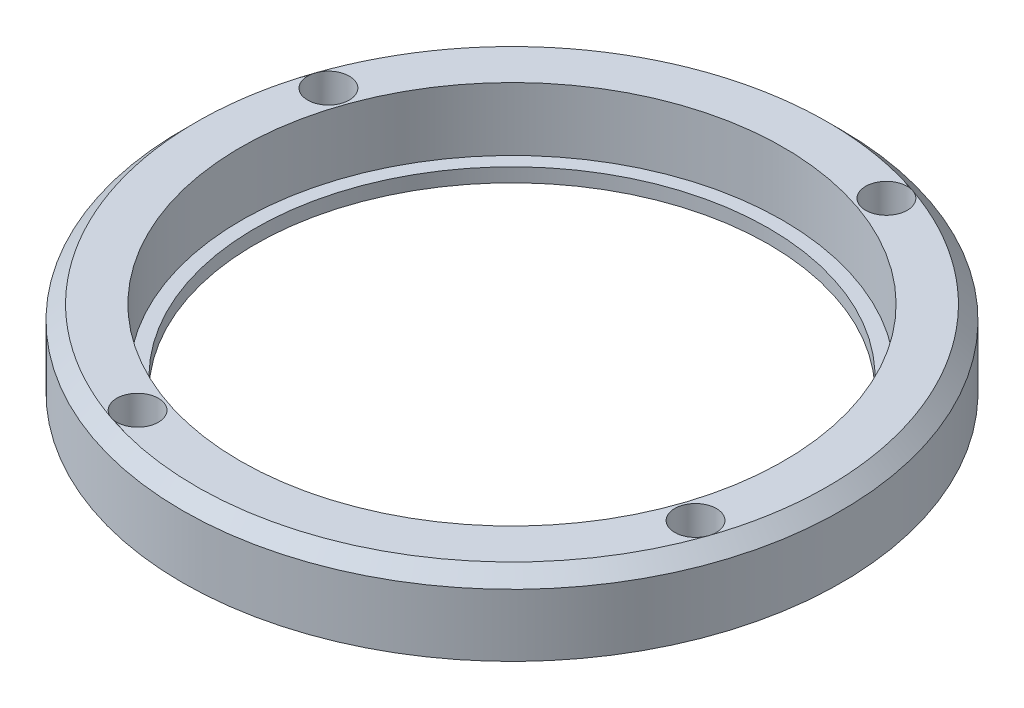
ISO-10303-21;
HEADER;
FILE_DESCRIPTION(('STEP AP214'),'2;1');
FILE_NAME('part.step','',(''),(''),'','','');
FILE_SCHEMA(('AUTOMOTIVE_DESIGN { 1 0 10303 214 1 1 1 1 }'));
ENDSEC;
DATA;
#1=APPLICATION_CONTEXT('core data for automotive mechanical design processes');
#2=APPLICATION_PROTOCOL_DEFINITION('international standard','automotive_design',2000,#1);
#3=PRODUCT_CONTEXT('',#1,'mechanical');
#4=PRODUCT('Part','Part','',(#3));
#5=PRODUCT_RELATED_PRODUCT_CATEGORY('part','',(#4));
#6=PRODUCT_DEFINITION_FORMATION('','',#4);
#7=PRODUCT_DEFINITION_CONTEXT('part definition',#1,'design');
#8=PRODUCT_DEFINITION('design','',#6,#7);
#9=PRODUCT_DEFINITION_SHAPE('','',#8);
#10=(LENGTH_UNIT() NAMED_UNIT(*) SI_UNIT(.MILLI.,.METRE.));
#11=(NAMED_UNIT(*) PLANE_ANGLE_UNIT() SI_UNIT($,.RADIAN.));
#12=(NAMED_UNIT(*) SI_UNIT($,.STERADIAN.) SOLID_ANGLE_UNIT());
#13=UNCERTAINTY_MEASURE_WITH_UNIT(LENGTH_MEASURE(1.E-05),#10,'distance_accuracy_value','');
#14=(GEOMETRIC_REPRESENTATION_CONTEXT(3) GLOBAL_UNCERTAINTY_ASSIGNED_CONTEXT((#13)) GLOBAL_UNIT_ASSIGNED_CONTEXT((#10,
#11,#12)) REPRESENTATION_CONTEXT('',''));
#15=CARTESIAN_POINT('',(0.,0.,0.));
#16=DIRECTION('',(0.,0.,1.));
#17=DIRECTION('',(1.,0.,0.));
#18=AXIS2_PLACEMENT_3D('',#15,#16,#17);
#19=CARTESIAN_POINT('',(0.,2.,0.));
#20=DIRECTION('',(0.,-1.,0.));
#21=DIRECTION('',(0.,0.,-1.));
#22=AXIS2_PLACEMENT_3D('',#19,#20,#21);
#23=CYLINDRICAL_SURFACE('',#22,39.);
#24=CARTESIAN_POINT('',(0.,2.,0.));
#25=DIRECTION('',(0.,-1.,0.));
#26=DIRECTION('',(0.,0.,-1.));
#27=AXIS2_PLACEMENT_3D('',#24,#25,#26);
#28=CIRCLE('',#27,39.);
#29=CARTESIAN_POINT('',(0.,2.,-39.));
#30=VERTEX_POINT('',#29);
#31=EDGE_CURVE('E11',#30,#30,#28,.T.);
#32=ORIENTED_EDGE('',*,*,#31,.T.);
#33=EDGE_LOOP('',(#32));
#34=FACE_BOUND('',#33,.T.);
#35=CARTESIAN_POINT('',(0.,0.,0.));
#36=DIRECTION('',(0.,-1.,0.));
#37=DIRECTION('',(0.,0.,-1.));
#38=AXIS2_PLACEMENT_3D('',#35,#36,#37);
#39=CIRCLE('',#38,39.);
#40=CARTESIAN_POINT('',(0.,0.,-39.));
#41=VERTEX_POINT('',#40);
#42=EDGE_CURVE('E44',#41,#41,#39,.T.);
#43=ORIENTED_EDGE('',*,*,#42,.F.);
#44=EDGE_LOOP('',(#43));
#45=FACE_BOUND('',#44,.T.);
#46=ADVANCED_FACE('F41',(#34,#45),#23,.T.);
#47=CARTESIAN_POINT('',(0.,2.,0.));
#48=DIRECTION('',(0.,-1.,0.));
#49=DIRECTION('',(0.,0.,-1.));
#50=AXIS2_PLACEMENT_3D('',#47,#48,#49);
#51=PLANE('',#50);
#52=CARTESIAN_POINT('',(0.,2.,0.));
#53=DIRECTION('',(0.,-1.,0.));
#54=DIRECTION('',(0.,0.,-1.));
#55=AXIS2_PLACEMENT_3D('',#52,#53,#54);
#56=CIRCLE('',#55,37.);
#57=CARTESIAN_POINT('',(0.,2.,-37.));
#58=VERTEX_POINT('',#57);
#59=EDGE_CURVE('E51',#58,#58,#56,.T.);
#60=ORIENTED_EDGE('',*,*,#59,.T.);
#61=EDGE_LOOP('',(#60));
#62=FACE_BOUND('',#61,.T.);
#63=ORIENTED_EDGE('',*,*,#31,.F.);
#64=EDGE_LOOP('',(#63));
#65=FACE_BOUND('',#64,.T.);
#66=ADVANCED_FACE('F59',(#62,#65),#51,.F.);
#67=CARTESIAN_POINT('',(0.,0.,0.));
#68=DIRECTION('',(0.,-1.,0.));
#69=DIRECTION('',(0.,0.,-1.));
#70=AXIS2_PLACEMENT_3D('',#67,#68,#69);
#71=PLANE('',#70);
#72=CARTESIAN_POINT('',(0.,0.,0.));
#73=DIRECTION('',(0.,-1.,0.));
#74=DIRECTION('',(0.,0.,-1.));
#75=AXIS2_PLACEMENT_3D('',#72,#73,#74);
#76=CIRCLE('',#75,37.);
#77=CARTESIAN_POINT('',(0.,0.,-37.));
#78=VERTEX_POINT('',#77);
#79=EDGE_CURVE('E53',#78,#78,#76,.T.);
#80=ORIENTED_EDGE('',*,*,#79,.F.);
#81=EDGE_LOOP('',(#80));
#82=FACE_BOUND('',#81,.T.);
#83=ORIENTED_EDGE('',*,*,#42,.T.);
#84=EDGE_LOOP('',(#83));
#85=FACE_BOUND('',#84,.T.);
#86=ADVANCED_FACE('F65',(#82,#85),#71,.T.);
#87=CARTESIAN_POINT('',(0.,2.,0.));
#88=DIRECTION('',(0.,-1.,0.));
#89=DIRECTION('',(0.,0.,-1.));
#90=AXIS2_PLACEMENT_3D('',#87,#88,#89);
#91=CYLINDRICAL_SURFACE('',#90,37.);
#92=ORIENTED_EDGE('',*,*,#59,.F.);
#93=EDGE_LOOP('',(#92));
#94=FACE_BOUND('',#93,.T.);
#95=ORIENTED_EDGE('',*,*,#79,.T.);
#96=EDGE_LOOP('',(#95));
#97=FACE_BOUND('',#96,.T.);
#98=ADVANCED_FACE('F62',(#94,#97),#91,.F.);
#99=CLOSED_SHELL('',(#46,#66,#86,#98));
#100=MANIFOLD_SOLID_BREP('B2',#99);
#101=CARTESIAN_POINT('',(-40.2120742919079,0.,-13.7564196338321));
#102=DIRECTION('',(0.,1.,0.));
#103=DIRECTION('',(0.,0.,1.));
#104=AXIS2_PLACEMENT_3D('',#101,#102,#103);
#105=CYLINDRICAL_SURFACE('',#104,1.75);
#106=CARTESIAN_POINT('',(-40.2120742919079,0.,-13.7564196338321));
#107=DIRECTION('',(0.,1.,0.));
#108=DIRECTION('',(0.,0.,1.));
#109=AXIS2_PLACEMENT_3D('',#106,#107,#108);
#110=CIRCLE('',#109,1.75);
#111=CARTESIAN_POINT('',(-40.2120742919079,0.,-12.0064196338321));
#112=VERTEX_POINT('',#111);
#113=EDGE_CURVE('E157',#112,#112,#110,.T.);
#114=ORIENTED_EDGE('',*,*,#113,.F.);
#115=EDGE_LOOP('',(#114));
#116=FACE_BOUND('',#115,.T.);
#117=CARTESIAN_POINT('',(-40.2120742919079,5.,-13.7564196338321));
#118=DIRECTION('',(0.,1.,0.));
#119=DIRECTION('',(0.,0.,1.));
#120=AXIS2_PLACEMENT_3D('',#117,#118,#119);
#121=CIRCLE('',#120,1.75);
#122=CARTESIAN_POINT('',(-40.2120742919079,5.,-12.0064196338321));
#123=VERTEX_POINT('',#122);
#124=EDGE_CURVE('E107',#123,#123,#121,.F.);
#125=ORIENTED_EDGE('',*,*,#124,.F.);
#126=EDGE_LOOP('',(#125));
#127=FACE_BOUND('',#126,.T.);
#128=ADVANCED_FACE('F103',(#116,#127),#105,.F.);
#129=CARTESIAN_POINT('',(-13.7564196338321,0.,40.2120742919079));
#130=DIRECTION('',(0.,1.,0.));
#131=DIRECTION('',(0.,0.,1.));
#132=AXIS2_PLACEMENT_3D('',#129,#130,#131);
#133=CYLINDRICAL_SURFACE('',#132,1.75);
#134=CARTESIAN_POINT('',(-13.7564196338321,0.,40.2120742919079));
#135=DIRECTION('',(0.,1.,0.));
#136=DIRECTION('',(0.,0.,1.));
#137=AXIS2_PLACEMENT_3D('',#134,#135,#136);
#138=CIRCLE('',#137,1.75);
#139=CARTESIAN_POINT('',(-13.7564196338321,0.,41.9620742919079));
#140=VERTEX_POINT('',#139);
#141=EDGE_CURVE('E154',#140,#140,#138,.T.);
#142=ORIENTED_EDGE('',*,*,#141,.F.);
#143=EDGE_LOOP('',(#142));
#144=FACE_BOUND('',#143,.T.);
#145=CARTESIAN_POINT('',(-13.7564196338321,5.,40.2120742919079));
#146=DIRECTION('',(0.,1.,0.));
#147=DIRECTION('',(0.,0.,1.));
#148=AXIS2_PLACEMENT_3D('',#145,#146,#147);
#149=CIRCLE('',#148,1.75);
#150=CARTESIAN_POINT('',(-13.7564196338321,5.,41.9620742919079));
#151=VERTEX_POINT('',#150);
#152=EDGE_CURVE('E177',#151,#151,#149,.F.);
#153=ORIENTED_EDGE('',*,*,#152,.F.);
#154=EDGE_LOOP('',(#153));
#155=FACE_BOUND('',#154,.T.);
#156=ADVANCED_FACE('F187',(#144,#155),#133,.F.);
#157=CARTESIAN_POINT('',(40.2120742919079,0.,13.7564196338322));
#158=DIRECTION('',(0.,1.,0.));
#159=DIRECTION('',(0.,0.,1.));
#160=AXIS2_PLACEMENT_3D('',#157,#158,#159);
#161=CYLINDRICAL_SURFACE('',#160,1.75);
#162=CARTESIAN_POINT('',(40.2120742919079,0.,13.7564196338322));
#163=DIRECTION('',(0.,1.,0.));
#164=DIRECTION('',(0.,0.,1.));
#165=AXIS2_PLACEMENT_3D('',#162,#163,#164);
#166=CIRCLE('',#165,1.75);
#167=CARTESIAN_POINT('',(40.2120742919079,0.,15.5064196338322));
#168=VERTEX_POINT('',#167);
#169=EDGE_CURVE('E151',#168,#168,#166,.T.);
#170=ORIENTED_EDGE('',*,*,#169,.F.);
#171=EDGE_LOOP('',(#170));
#172=FACE_BOUND('',#171,.T.);
#173=CARTESIAN_POINT('',(40.2120742919079,5.,13.7564196338322));
#174=DIRECTION('',(0.,1.,0.));
#175=DIRECTION('',(0.,0.,1.));
#176=AXIS2_PLACEMENT_3D('',#173,#174,#175);
#177=CIRCLE('',#176,1.75);
#178=CARTESIAN_POINT('',(40.2120742919079,5.,15.5064196338322));
#179=VERTEX_POINT('',#178);
#180=EDGE_CURVE('E174',#179,#179,#177,.F.);
#181=ORIENTED_EDGE('',*,*,#180,.F.);
#182=EDGE_LOOP('',(#181));
#183=FACE_BOUND('',#182,.T.);
#184=ADVANCED_FACE('F193',(#172,#183),#161,.F.);
#185=CARTESIAN_POINT('',(13.7564196338321,0.,-40.2120742919078));
#186=DIRECTION('',(0.,1.,0.));
#187=DIRECTION('',(0.,0.,1.));
#188=AXIS2_PLACEMENT_3D('',#185,#186,#187);
#189=CYLINDRICAL_SURFACE('',#188,1.75000000000001);
#190=CARTESIAN_POINT('',(13.7564196338321,0.,-40.2120742919078));
#191=DIRECTION('',(0.,1.,0.));
#192=DIRECTION('',(0.,0.,1.));
#193=AXIS2_PLACEMENT_3D('',#190,#191,#192);
#194=CIRCLE('',#193,1.75000000000001);
#195=CARTESIAN_POINT('',(13.7564196338321,0.,-38.4620742919078));
#196=VERTEX_POINT('',#195);
#197=EDGE_CURVE('E147',#196,#196,#194,.T.);
#198=ORIENTED_EDGE('',*,*,#197,.F.);
#199=EDGE_LOOP('',(#198));
#200=FACE_BOUND('',#199,.T.);
#201=CARTESIAN_POINT('',(13.7564196338321,5.,-40.2120742919078));
#202=DIRECTION('',(0.,1.,0.));
#203=DIRECTION('',(0.,0.,1.));
#204=AXIS2_PLACEMENT_3D('',#201,#202,#203);
#205=CIRCLE('',#204,1.75000000000001);
#206=CARTESIAN_POINT('',(13.7564196338321,5.,-38.4620742919078));
#207=VERTEX_POINT('',#206);
#208=EDGE_CURVE('E171',#207,#207,#205,.F.);
#209=ORIENTED_EDGE('',*,*,#208,.F.);
#210=EDGE_LOOP('',(#209));
#211=FACE_BOUND('',#210,.T.);
#212=ADVANCED_FACE('F211',(#200,#211),#189,.F.);
#213=CARTESIAN_POINT('',(0.,11.,0.));
#214=DIRECTION('',(0.,-1.,0.));
#215=DIRECTION('',(0.,0.,-1.));
#216=AXIS2_PLACEMENT_3D('',#213,#214,#215);
#217=CYLINDRICAL_SURFACE('',#216,47.5);
#218=CARTESIAN_POINT('',(0.,9.00000000000001,0.));
#219=DIRECTION('',(0.,1.,0.));
#220=DIRECTION('',(0.,0.,1.));
#221=AXIS2_PLACEMENT_3D('',#218,#219,#220);
#222=CIRCLE('',#221,47.5);
#223=CARTESIAN_POINT('',(0.,9.00000000000001,47.5));
#224=VERTEX_POINT('',#223);
#225=EDGE_CURVE('E39',#224,#224,#222,.F.);
#226=ORIENTED_EDGE('',*,*,#225,.T.);
#227=EDGE_LOOP('',(#226));
#228=FACE_BOUND('',#227,.T.);
#229=CARTESIAN_POINT('',(0.,0.,0.));
#230=DIRECTION('',(0.,1.,0.));
#231=DIRECTION('',(0.,0.,1.));
#232=AXIS2_PLACEMENT_3D('',#229,#230,#231);
#233=CIRCLE('',#232,47.5);
#234=CARTESIAN_POINT('',(0.,0.,47.5));
#235=VERTEX_POINT('',#234);
#236=EDGE_CURVE('E163',#235,#235,#233,.T.);
#237=ORIENTED_EDGE('',*,*,#236,.T.);
#238=EDGE_LOOP('',(#237));
#239=FACE_BOUND('',#238,.T.);
#240=ADVANCED_FACE('F207',(#228,#239),#217,.T.);
#241=CARTESIAN_POINT('',(0.,11.,0.));
#242=DIRECTION('',(0.,1.,0.));
#243=DIRECTION('',(0.,0.,1.));
#244=AXIS2_PLACEMENT_3D('',#241,#242,#243);
#245=PLANE('',#244);
#246=CARTESIAN_POINT('',(0.,11.,0.));
#247=DIRECTION('',(0.,1.,0.));
#248=DIRECTION('',(0.,0.,1.));
#249=AXIS2_PLACEMENT_3D('',#246,#247,#248);
#250=CIRCLE('',#249,45.5);
#251=CARTESIAN_POINT('',(-43.0505736536896,11.,-14.7274610197496));
#252=VERTEX_POINT('',#251);
#253=CARTESIAN_POINT('',(-14.7274610197497,11.,43.0505736536896));
#254=VERTEX_POINT('',#253);
#255=EDGE_CURVE('E390',#252,#254,#250,.T.);
#256=ORIENTED_EDGE('',*,*,#255,.T.);
#257=CARTESIAN_POINT('',(-13.7564196338321,11.,40.2120742919079));
#258=DIRECTION('',(0.,1.,0.));
#259=DIRECTION('',(0.,0.,1.));
#260=AXIS2_PLACEMENT_3D('',#257,#258,#259);
#261=CIRCLE('',#260,3.);
#262=EDGE_CURVE('E118',#254,#254,#261,.T.);
#263=ORIENTED_EDGE('',*,*,#262,.F.);
#264=CARTESIAN_POINT('',(43.0505736536896,11.,14.7274610197497));
#265=VERTEX_POINT('',#264);
#266=EDGE_CURVE('E168',#254,#265,#250,.T.);
#267=ORIENTED_EDGE('',*,*,#266,.T.);
#268=CARTESIAN_POINT('',(40.2120742919079,11.,13.7564196338322));
#269=DIRECTION('',(0.,1.,0.));
#270=DIRECTION('',(0.,0.,1.));
#271=AXIS2_PLACEMENT_3D('',#268,#269,#270);
#272=CIRCLE('',#271,3.);
#273=EDGE_CURVE('E131',#265,#265,#272,.T.);
#274=ORIENTED_EDGE('',*,*,#273,.F.);
#275=CARTESIAN_POINT('',(14.7274610197497,11.,-43.0505736536896));
#276=VERTEX_POINT('',#275);
#277=EDGE_CURVE('E112',#265,#276,#250,.T.);
#278=ORIENTED_EDGE('',*,*,#277,.T.);
#279=CARTESIAN_POINT('',(13.7564196338321,11.,-40.2120742919078));
#280=DIRECTION('',(0.,1.,0.));
#281=DIRECTION('',(0.,0.,1.));
#282=AXIS2_PLACEMENT_3D('',#279,#280,#281);
#283=CIRCLE('',#282,2.99999999999999);
#284=EDGE_CURVE('E140',#276,#276,#283,.T.);
#285=ORIENTED_EDGE('',*,*,#284,.F.);
#286=EDGE_CURVE('E169',#276,#252,#250,.T.);
#287=ORIENTED_EDGE('',*,*,#286,.T.);
#288=CARTESIAN_POINT('',(-40.2120742919079,11.,-13.7564196338321));
#289=DIRECTION('',(0.,1.,0.));
#290=DIRECTION('',(0.,0.,1.));
#291=AXIS2_PLACEMENT_3D('',#288,#289,#290);
#292=CIRCLE('',#291,3.);
#293=EDGE_CURVE('E123',#252,#252,#292,.T.);
#294=ORIENTED_EDGE('',*,*,#293,.F.);
#295=EDGE_LOOP('',(#256,#263,#267,#274,#278,#285,#287,#294));
#296=FACE_BOUND('',#295,.T.);
#297=CARTESIAN_POINT('',(0.,11.,0.));
#298=DIRECTION('',(0.,1.,0.));
#299=DIRECTION('',(0.,0.,1.));
#300=AXIS2_PLACEMENT_3D('',#297,#298,#299);
#301=CIRCLE('',#300,39.15);
#302=CARTESIAN_POINT('',(0.,11.,39.15));
#303=VERTEX_POINT('',#302);
#304=EDGE_CURVE('E150',#303,#303,#301,.T.);
#305=ORIENTED_EDGE('',*,*,#304,.F.);
#306=EDGE_LOOP('',(#305));
#307=FACE_BOUND('',#306,.T.);
#308=ADVANCED_FACE('F204',(#296,#307),#245,.T.);
#309=CARTESIAN_POINT('',(0.,0.,0.));
#310=DIRECTION('',(0.,1.,0.));
#311=DIRECTION('',(0.,0.,1.));
#312=AXIS2_PLACEMENT_3D('',#309,#310,#311);
#313=PLANE('',#312);
#314=ORIENTED_EDGE('',*,*,#197,.T.);
#315=EDGE_LOOP('',(#314));
#316=FACE_BOUND('',#315,.T.);
#317=ORIENTED_EDGE('',*,*,#169,.T.);
#318=EDGE_LOOP('',(#317));
#319=FACE_BOUND('',#318,.T.);
#320=ORIENTED_EDGE('',*,*,#141,.T.);
#321=EDGE_LOOP('',(#320));
#322=FACE_BOUND('',#321,.T.);
#323=ORIENTED_EDGE('',*,*,#113,.T.);
#324=EDGE_LOOP('',(#323));
#325=FACE_BOUND('',#324,.T.);
#326=CARTESIAN_POINT('',(0.,0.,0.));
#327=DIRECTION('',(0.,1.,0.));
#328=DIRECTION('',(0.,0.,1.));
#329=AXIS2_PLACEMENT_3D('',#326,#327,#328);
#330=CIRCLE('',#329,39.15);
#331=CARTESIAN_POINT('',(0.,0.,39.15));
#332=VERTEX_POINT('',#331);
#333=EDGE_CURVE('E160',#332,#332,#330,.T.);
#334=ORIENTED_EDGE('',*,*,#333,.T.);
#335=EDGE_LOOP('',(#334));
#336=FACE_BOUND('',#335,.T.);
#337=ORIENTED_EDGE('',*,*,#236,.F.);
#338=EDGE_LOOP('',(#337));
#339=FACE_BOUND('',#338,.T.);
#340=ADVANCED_FACE('F202',(#316,#319,#322,#325,#336,#339),#313,.F.);
#341=CARTESIAN_POINT('',(0.,0.,0.));
#342=DIRECTION('',(0.,1.,0.));
#343=DIRECTION('',(0.,0.,1.));
#344=AXIS2_PLACEMENT_3D('',#341,#342,#343);
#345=CYLINDRICAL_SURFACE('',#344,39.15);
#346=ORIENTED_EDGE('',*,*,#333,.F.);
#347=EDGE_LOOP('',(#346));
#348=FACE_BOUND('',#347,.T.);
#349=ORIENTED_EDGE('',*,*,#304,.T.);
#350=EDGE_LOOP('',(#349));
#351=FACE_BOUND('',#350,.T.);
#352=ADVANCED_FACE('F199',(#348,#351),#345,.F.);
#353=CARTESIAN_POINT('',(0.,11.,0.));
#354=DIRECTION('',(0.,-1.,0.));
#355=DIRECTION('',(0.,0.,-1.));
#356=AXIS2_PLACEMENT_3D('',#353,#354,#355);
#357=CONICAL_SURFACE('',#356,45.5,0.785398163397448);
#358=ORIENTED_EDGE('',*,*,#225,.F.);
#359=EDGE_LOOP('',(#358));
#360=FACE_BOUND('',#359,.T.);
#361=ORIENTED_EDGE('',*,*,#277,.F.);
#362=ORIENTED_EDGE('',*,*,#266,.F.);
#363=ORIENTED_EDGE('',*,*,#255,.F.);
#364=ORIENTED_EDGE('',*,*,#286,.F.);
#365=EDGE_LOOP('',(#361,#362,#363,#364));
#366=FACE_BOUND('',#365,.T.);
#367=ADVANCED_FACE('F105',(#360,#366),#357,.T.);
#368=CARTESIAN_POINT('',(13.7564196338321,5.,-40.2120742919078));
#369=DIRECTION('',(0.,1.,0.));
#370=DIRECTION('',(0.,0.,1.));
#371=AXIS2_PLACEMENT_3D('',#368,#369,#370);
#372=PLANE('',#371);
#373=CARTESIAN_POINT('',(13.7564196338321,5.,-40.2120742919078));
#374=DIRECTION('',(0.,1.,0.));
#375=DIRECTION('',(0.,0.,1.));
#376=AXIS2_PLACEMENT_3D('',#373,#374,#375);
#377=CIRCLE('',#376,2.99999999999999);
#378=CARTESIAN_POINT('',(13.7564196338321,5.,-37.2120742919078));
#379=VERTEX_POINT('',#378);
#380=EDGE_CURVE('E235',#379,#379,#377,.T.);
#381=ORIENTED_EDGE('',*,*,#380,.T.);
#382=EDGE_LOOP('',(#381));
#383=FACE_BOUND('',#382,.T.);
#384=ORIENTED_EDGE('',*,*,#208,.T.);
#385=EDGE_LOOP('',(#384));
#386=FACE_BOUND('',#385,.T.);
#387=ADVANCED_FACE('F225',(#383,#386),#372,.T.);
#388=CARTESIAN_POINT('',(13.7564196338321,5.,-40.2120742919078));
#389=DIRECTION('',(0.,1.,0.));
#390=DIRECTION('',(0.,0.,1.));
#391=AXIS2_PLACEMENT_3D('',#388,#389,#390);
#392=CYLINDRICAL_SURFACE('',#391,2.99999999999999);
#393=ORIENTED_EDGE('',*,*,#380,.F.);
#394=EDGE_LOOP('',(#393));
#395=FACE_BOUND('',#394,.T.);
#396=ORIENTED_EDGE('',*,*,#284,.T.);
#397=EDGE_LOOP('',(#396));
#398=FACE_BOUND('',#397,.T.);
#399=ADVANCED_FACE('F259',(#395,#398),#392,.F.);
#400=CARTESIAN_POINT('',(40.2120742919079,5.,13.7564196338322));
#401=DIRECTION('',(0.,1.,0.));
#402=DIRECTION('',(0.,0.,1.));
#403=AXIS2_PLACEMENT_3D('',#400,#401,#402);
#404=PLANE('',#403);
#405=CARTESIAN_POINT('',(40.2120742919079,5.,13.7564196338322));
#406=DIRECTION('',(0.,1.,0.));
#407=DIRECTION('',(0.,0.,1.));
#408=AXIS2_PLACEMENT_3D('',#405,#406,#407);
#409=CIRCLE('',#408,3.);
#410=CARTESIAN_POINT('',(40.2120742919079,5.,16.7564196338322));
#411=VERTEX_POINT('',#410);
#412=EDGE_CURVE('E136',#411,#411,#409,.T.);
#413=ORIENTED_EDGE('',*,*,#412,.T.);
#414=EDGE_LOOP('',(#413));
#415=FACE_BOUND('',#414,.T.);
#416=ORIENTED_EDGE('',*,*,#180,.T.);
#417=EDGE_LOOP('',(#416));
#418=FACE_BOUND('',#417,.T.);
#419=ADVANCED_FACE('F263',(#415,#418),#404,.T.);
#420=CARTESIAN_POINT('',(40.2120742919079,5.,13.7564196338322));
#421=DIRECTION('',(0.,1.,0.));
#422=DIRECTION('',(0.,0.,1.));
#423=AXIS2_PLACEMENT_3D('',#420,#421,#422);
#424=CYLINDRICAL_SURFACE('',#423,3.);
#425=ORIENTED_EDGE('',*,*,#412,.F.);
#426=EDGE_LOOP('',(#425));
#427=FACE_BOUND('',#426,.T.);
#428=ORIENTED_EDGE('',*,*,#273,.T.);
#429=EDGE_LOOP('',(#428));
#430=FACE_BOUND('',#429,.T.);
#431=ADVANCED_FACE('F132',(#427,#430),#424,.F.);
#432=CARTESIAN_POINT('',(-13.7564196338321,5.,40.2120742919079));
#433=DIRECTION('',(0.,1.,0.));
#434=DIRECTION('',(0.,0.,1.));
#435=AXIS2_PLACEMENT_3D('',#432,#433,#434);
#436=PLANE('',#435);
#437=CARTESIAN_POINT('',(-13.7564196338321,5.,40.2120742919079));
#438=DIRECTION('',(0.,1.,0.));
#439=DIRECTION('',(0.,0.,1.));
#440=AXIS2_PLACEMENT_3D('',#437,#438,#439);
#441=CIRCLE('',#440,3.);
#442=CARTESIAN_POINT('',(-13.7564196338321,5.,43.2120742919079));
#443=VERTEX_POINT('',#442);
#444=EDGE_CURVE('E175',#443,#443,#441,.T.);
#445=ORIENTED_EDGE('',*,*,#444,.T.);
#446=EDGE_LOOP('',(#445));
#447=FACE_BOUND('',#446,.T.);
#448=ORIENTED_EDGE('',*,*,#152,.T.);
#449=EDGE_LOOP('',(#448));
#450=FACE_BOUND('',#449,.T.);
#451=ADVANCED_FACE('F243',(#447,#450),#436,.T.);
#452=CARTESIAN_POINT('',(-13.7564196338321,5.,40.2120742919079));
#453=DIRECTION('',(0.,1.,0.));
#454=DIRECTION('',(0.,0.,1.));
#455=AXIS2_PLACEMENT_3D('',#452,#453,#454);
#456=CYLINDRICAL_SURFACE('',#455,3.);
#457=ORIENTED_EDGE('',*,*,#444,.F.);
#458=EDGE_LOOP('',(#457));
#459=FACE_BOUND('',#458,.T.);
#460=ORIENTED_EDGE('',*,*,#262,.T.);
#461=EDGE_LOOP('',(#460));
#462=FACE_BOUND('',#461,.T.);
#463=ADVANCED_FACE('F245',(#459,#462),#456,.F.);
#464=CARTESIAN_POINT('',(-40.2120742919079,5.,-13.7564196338321));
#465=DIRECTION('',(0.,1.,0.));
#466=DIRECTION('',(0.,0.,1.));
#467=AXIS2_PLACEMENT_3D('',#464,#465,#466);
#468=PLANE('',#467);
#469=CARTESIAN_POINT('',(-40.2120742919079,5.,-13.7564196338321));
#470=DIRECTION('',(0.,1.,0.));
#471=DIRECTION('',(0.,0.,1.));
#472=AXIS2_PLACEMENT_3D('',#469,#470,#471);
#473=CIRCLE('',#472,3.);
#474=CARTESIAN_POINT('',(-40.2120742919079,5.,-10.7564196338321));
#475=VERTEX_POINT('',#474);
#476=EDGE_CURVE('E137',#475,#475,#473,.T.);
#477=ORIENTED_EDGE('',*,*,#476,.T.);
#478=EDGE_LOOP('',(#477));
#479=FACE_BOUND('',#478,.T.);
#480=ORIENTED_EDGE('',*,*,#124,.T.);
#481=EDGE_LOOP('',(#480));
#482=FACE_BOUND('',#481,.T.);
#483=ADVANCED_FACE('F184',(#479,#482),#468,.T.);
#484=CARTESIAN_POINT('',(-40.2120742919079,5.,-13.7564196338321));
#485=DIRECTION('',(0.,1.,0.));
#486=DIRECTION('',(0.,0.,1.));
#487=AXIS2_PLACEMENT_3D('',#484,#485,#486);
#488=CYLINDRICAL_SURFACE('',#487,3.);
#489=ORIENTED_EDGE('',*,*,#476,.F.);
#490=EDGE_LOOP('',(#489));
#491=FACE_BOUND('',#490,.T.);
#492=ORIENTED_EDGE('',*,*,#293,.T.);
#493=EDGE_LOOP('',(#492));
#494=FACE_BOUND('',#493,.T.);
#495=ADVANCED_FACE('F252',(#491,#494),#488,.F.);
#496=CLOSED_SHELL('',(#128,#156,#184,#212,#240,#308,#340,#352,#367,#387,#399,#419,#431,#451,
#463,#483,#495));
#497=MANIFOLD_SOLID_BREP('B6',#496);
#498=ADVANCED_BREP_SHAPE_REPRESENTATION('',(#18,#100,#497),#14);
#499=SHAPE_DEFINITION_REPRESENTATION(#9,#498);
ENDSEC;
END-ISO-10303-21;
